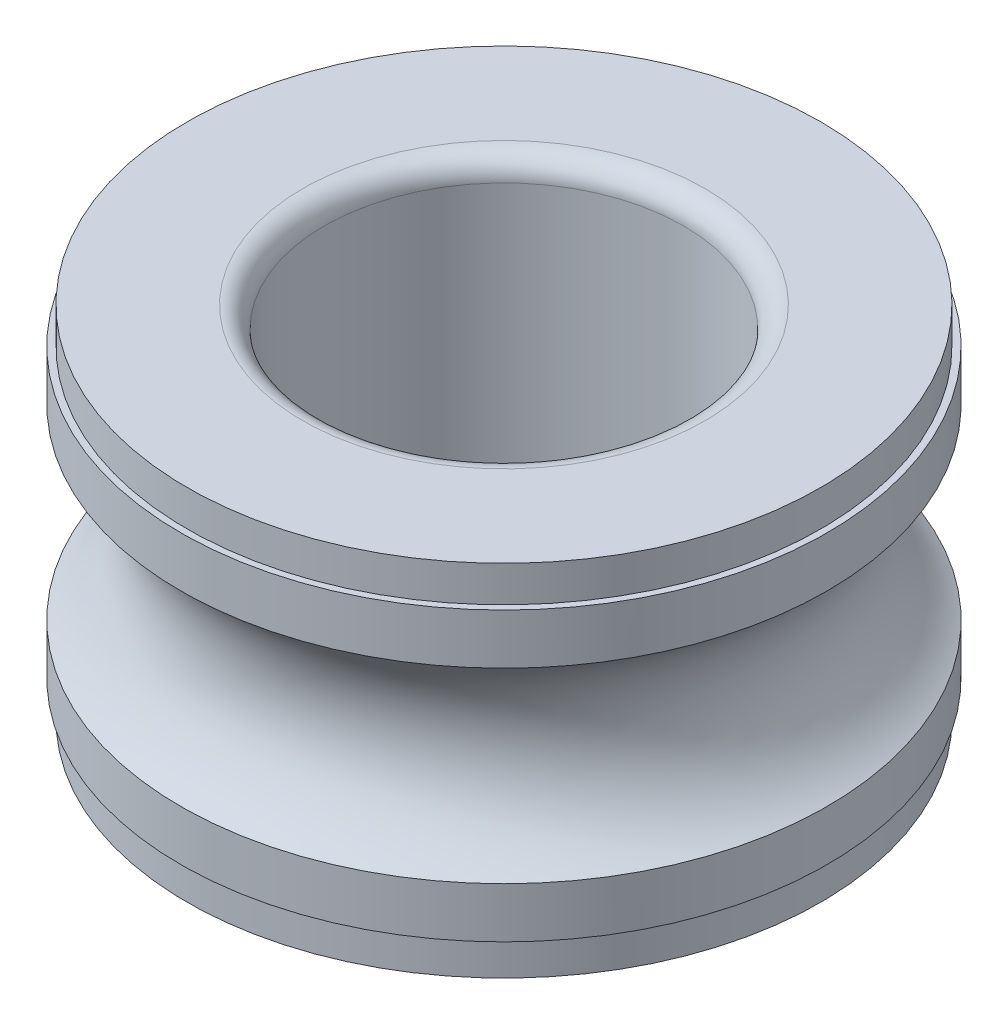
ISO-10303-21;
HEADER;
FILE_DESCRIPTION(('STEP AP214'),'2;1');
FILE_NAME('part.step','',(''),(''),'','','');
FILE_SCHEMA(('AUTOMOTIVE_DESIGN { 1 0 10303 214 1 1 1 1 }'));
ENDSEC;
DATA;
#1=APPLICATION_CONTEXT('core data for automotive mechanical design processes');
#2=APPLICATION_PROTOCOL_DEFINITION('international standard','automotive_design',2000,#1);
#3=PRODUCT_CONTEXT('',#1,'mechanical');
#4=PRODUCT('Part','Part','',(#3));
#5=PRODUCT_RELATED_PRODUCT_CATEGORY('part','',(#4));
#6=PRODUCT_DEFINITION_FORMATION('','',#4);
#7=PRODUCT_DEFINITION_CONTEXT('part definition',#1,'design');
#8=PRODUCT_DEFINITION('design','',#6,#7);
#9=PRODUCT_DEFINITION_SHAPE('','',#8);
#10=(LENGTH_UNIT() NAMED_UNIT(*) SI_UNIT(.MILLI.,.METRE.));
#11=(NAMED_UNIT(*) PLANE_ANGLE_UNIT() SI_UNIT($,.RADIAN.));
#12=(NAMED_UNIT(*) SI_UNIT($,.STERADIAN.) SOLID_ANGLE_UNIT());
#13=UNCERTAINTY_MEASURE_WITH_UNIT(LENGTH_MEASURE(1.E-05),#10,'distance_accuracy_value','');
#14=(GEOMETRIC_REPRESENTATION_CONTEXT(3) GLOBAL_UNCERTAINTY_ASSIGNED_CONTEXT((#13)) GLOBAL_UNIT_ASSIGNED_CONTEXT((#10,
#11,#12)) REPRESENTATION_CONTEXT('',''));
#15=CARTESIAN_POINT('',(0.,0.,0.));
#16=DIRECTION('',(0.,0.,1.));
#17=DIRECTION('',(1.,0.,0.));
#18=AXIS2_PLACEMENT_3D('',#15,#16,#17);
#19=CARTESIAN_POINT('',(0.,-2.5,0.));
#20=DIRECTION('',(0.,1.,0.));
#21=DIRECTION('',(0.,0.,1.));
#22=AXIS2_PLACEMENT_3D('',#19,#20,#21);
#23=CYLINDRICAL_SURFACE('',#22,2.5);
#24=CARTESIAN_POINT('',(0.,-0.3,0.));
#25=DIRECTION('',(0.,1.,0.));
#26=DIRECTION('',(0.,0.,1.));
#27=AXIS2_PLACEMENT_3D('',#24,#25,#26);
#28=CIRCLE('',#27,2.5);
#29=CARTESIAN_POINT('',(0.,-0.3,-2.5));
#30=VERTEX_POINT('',#29);
#31=EDGE_CURVE('E11',#30,#30,#28,.T.);
#32=ORIENTED_EDGE('',*,*,#31,.T.);
#33=EDGE_LOOP('',(#32));
#34=FACE_BOUND('',#33,.T.);
#35=CARTESIAN_POINT('',(0.,-4.7,0.));
#36=DIRECTION('',(0.,1.,0.));
#37=DIRECTION('',(0.,0.,1.));
#38=AXIS2_PLACEMENT_3D('',#35,#36,#37);
#39=CIRCLE('',#38,2.5);
#40=CARTESIAN_POINT('',(0.,-4.7,-2.5));
#41=VERTEX_POINT('',#40);
#42=EDGE_CURVE('E28',#41,#41,#39,.T.);
#43=ORIENTED_EDGE('',*,*,#42,.F.);
#44=EDGE_LOOP('',(#43));
#45=FACE_BOUND('',#44,.T.);
#46=ADVANCED_FACE('F17',(#34,#45),#23,.F.);
#47=CARTESIAN_POINT('',(0.,-4.7,0.));
#48=DIRECTION('',(0.,1.,0.));
#49=DIRECTION('',(0.,0.,1.));
#50=AXIS2_PLACEMENT_3D('',#47,#48,#49);
#51=TOROIDAL_SURFACE('',#50,2.8,0.3);
#52=ORIENTED_EDGE('',*,*,#42,.T.);
#53=EDGE_LOOP('',(#52));
#54=FACE_BOUND('',#53,.T.);
#55=CARTESIAN_POINT('',(0.,-5.,0.));
#56=DIRECTION('',(0.,1.,0.));
#57=DIRECTION('',(0.,0.,1.));
#58=AXIS2_PLACEMENT_3D('',#55,#56,#57);
#59=CIRCLE('',#58,2.8);
#60=CARTESIAN_POINT('',(0.,-5.,-2.8));
#61=VERTEX_POINT('',#60);
#62=EDGE_CURVE('E118',#61,#61,#59,.T.);
#63=ORIENTED_EDGE('',*,*,#62,.F.);
#64=EDGE_LOOP('',(#63));
#65=FACE_BOUND('',#64,.T.);
#66=ADVANCED_FACE('F180',(#54,#65),#51,.T.);
#67=CARTESIAN_POINT('',(0.,-0.3,0.));
#68=DIRECTION('',(0.,1.,0.));
#69=DIRECTION('',(0.,0.,1.));
#70=AXIS2_PLACEMENT_3D('',#67,#68,#69);
#71=TOROIDAL_SURFACE('',#70,2.8,0.3);
#72=CARTESIAN_POINT('',(0.,0.,0.));
#73=DIRECTION('',(0.,1.,0.));
#74=DIRECTION('',(0.,0.,1.));
#75=AXIS2_PLACEMENT_3D('',#72,#73,#74);
#76=CIRCLE('',#75,2.8);
#77=CARTESIAN_POINT('',(0.,0.,-2.8));
#78=VERTEX_POINT('',#77);
#79=EDGE_CURVE('E121',#78,#78,#76,.T.);
#80=ORIENTED_EDGE('',*,*,#79,.T.);
#81=EDGE_LOOP('',(#80));
#82=FACE_BOUND('',#81,.T.);
#83=ORIENTED_EDGE('',*,*,#31,.F.);
#84=EDGE_LOOP('',(#83));
#85=FACE_BOUND('',#84,.T.);
#86=ADVANCED_FACE('F184',(#82,#85),#71,.T.);
#87=CARTESIAN_POINT('',(0.,-5.,3.605));
#88=DIRECTION('',(0.,-1.,0.));
#89=DIRECTION('',(-1.,0.,0.));
#90=AXIS2_PLACEMENT_3D('',#87,#88,#89);
#91=PLANE('',#90);
#92=CARTESIAN_POINT('',(0.,-5.,0.));
#93=DIRECTION('',(0.,1.,0.));
#94=DIRECTION('',(0.,0.,1.));
#95=AXIS2_PLACEMENT_3D('',#92,#93,#94);
#96=CIRCLE('',#95,4.41);
#97=CARTESIAN_POINT('',(0.,-5.,-4.41));
#98=VERTEX_POINT('',#97);
#99=EDGE_CURVE('E113',#98,#98,#96,.T.);
#100=ORIENTED_EDGE('',*,*,#99,.F.);
#101=EDGE_LOOP('',(#100));
#102=FACE_BOUND('',#101,.T.);
#103=ORIENTED_EDGE('',*,*,#62,.T.);
#104=EDGE_LOOP('',(#103));
#105=FACE_BOUND('',#104,.T.);
#106=ADVANCED_FACE('F206',(#102,#105),#91,.T.);
#107=CARTESIAN_POINT('',(0.,0.,3.605));
#108=DIRECTION('',(0.,1.,0.));
#109=DIRECTION('',(1.,0.,0.));
#110=AXIS2_PLACEMENT_3D('',#107,#108,#109);
#111=PLANE('',#110);
#112=ORIENTED_EDGE('',*,*,#79,.F.);
#113=EDGE_LOOP('',(#112));
#114=FACE_BOUND('',#113,.T.);
#115=CARTESIAN_POINT('',(0.,0.,0.));
#116=DIRECTION('',(0.,1.,0.));
#117=DIRECTION('',(0.,0.,1.));
#118=AXIS2_PLACEMENT_3D('',#115,#116,#117);
#119=CIRCLE('',#118,4.41);
#120=CARTESIAN_POINT('',(0.,0.,-4.41));
#121=VERTEX_POINT('',#120);
#122=EDGE_CURVE('E109',#121,#121,#119,.T.);
#123=ORIENTED_EDGE('',*,*,#122,.T.);
#124=EDGE_LOOP('',(#123));
#125=FACE_BOUND('',#124,.T.);
#126=ADVANCED_FACE('F210',(#114,#125),#111,.T.);
#127=CARTESIAN_POINT('',(0.,-4.75,0.));
#128=DIRECTION('',(0.,1.,0.));
#129=DIRECTION('',(0.,0.,1.));
#130=AXIS2_PLACEMENT_3D('',#127,#128,#129);
#131=CYLINDRICAL_SURFACE('',#130,4.41);
#132=ORIENTED_EDGE('',*,*,#99,.T.);
#133=EDGE_LOOP('',(#132));
#134=FACE_BOUND('',#133,.T.);
#135=CARTESIAN_POINT('',(0.,-4.5,0.));
#136=DIRECTION('',(0.,1.,0.));
#137=DIRECTION('',(0.,0.,1.));
#138=AXIS2_PLACEMENT_3D('',#135,#136,#137);
#139=CIRCLE('',#138,4.41);
#140=CARTESIAN_POINT('',(0.,-4.5,-4.41));
#141=VERTEX_POINT('',#140);
#142=EDGE_CURVE('E137',#141,#141,#139,.T.);
#143=ORIENTED_EDGE('',*,*,#142,.F.);
#144=EDGE_LOOP('',(#143));
#145=FACE_BOUND('',#144,.T.);
#146=ADVANCED_FACE('F19',(#134,#145),#131,.T.);
#147=CARTESIAN_POINT('',(0.,-2.5,0.));
#148=DIRECTION('',(0.,1.,0.));
#149=DIRECTION('',(0.,0.,1.));
#150=AXIS2_PLACEMENT_3D('',#147,#148,#149);
#151=TOROIDAL_SURFACE('',#150,5.25,1.5);
#152=CARTESIAN_POINT('',(0.,-1.20096189432334,0.));
#153=DIRECTION('',(0.,1.,0.));
#154=DIRECTION('',(0.,0.,1.));
#155=AXIS2_PLACEMENT_3D('',#152,#153,#154);
#156=CIRCLE('',#155,4.5);
#157=CARTESIAN_POINT('',(4.5,-1.20096189432334,0.));
#158=VERTEX_POINT('',#157);
#159=EDGE_CURVE('E95',#158,#158,#156,.T.);
#160=ORIENTED_EDGE('',*,*,#159,.F.);
#161=EDGE_LOOP('',(#160));
#162=FACE_BOUND('',#161,.T.);
#163=CARTESIAN_POINT('',(0.,-3.79903810567666,0.));
#164=DIRECTION('',(0.,1.,0.));
#165=DIRECTION('',(0.,0.,1.));
#166=AXIS2_PLACEMENT_3D('',#163,#164,#165);
#167=CIRCLE('',#166,4.5);
#168=CARTESIAN_POINT('',(3.18198051533947,-3.79903810567666,3.18198051533946));
#169=VERTEX_POINT('',#168);
#170=EDGE_CURVE('E111',#169,#169,#167,.T.);
#171=ORIENTED_EDGE('',*,*,#170,.T.);
#172=EDGE_LOOP('',(#171));
#173=FACE_BOUND('',#172,.T.);
#174=ADVANCED_FACE('F96',(#162,#173),#151,.F.);
#175=CARTESIAN_POINT('',(0.,-0.25,0.));
#176=DIRECTION('',(0.,1.,0.));
#177=DIRECTION('',(0.,0.,1.));
#178=AXIS2_PLACEMENT_3D('',#175,#176,#177);
#179=CYLINDRICAL_SURFACE('',#178,4.41);
#180=CARTESIAN_POINT('',(0.,-0.5,0.));
#181=DIRECTION('',(0.,1.,0.));
#182=DIRECTION('',(0.,0.,1.));
#183=AXIS2_PLACEMENT_3D('',#180,#181,#182);
#184=CIRCLE('',#183,4.41);
#185=CARTESIAN_POINT('',(0.,-0.5,-4.41));
#186=VERTEX_POINT('',#185);
#187=EDGE_CURVE('E65',#186,#186,#184,.T.);
#188=ORIENTED_EDGE('',*,*,#187,.T.);
#189=EDGE_LOOP('',(#188));
#190=FACE_BOUND('',#189,.T.);
#191=ORIENTED_EDGE('',*,*,#122,.F.);
#192=EDGE_LOOP('',(#191));
#193=FACE_BOUND('',#192,.T.);
#194=ADVANCED_FACE('F143',(#190,#193),#179,.T.);
#195=CARTESIAN_POINT('',(0.,-4.5,4.455));
#196=DIRECTION('',(0.,-1.,0.));
#197=DIRECTION('',(-1.,0.,0.));
#198=AXIS2_PLACEMENT_3D('',#195,#196,#197);
#199=PLANE('',#198);
#200=CARTESIAN_POINT('',(0.,-4.5,0.));
#201=DIRECTION('',(0.,1.,0.));
#202=DIRECTION('',(0.,0.,1.));
#203=AXIS2_PLACEMENT_3D('',#200,#201,#202);
#204=CIRCLE('',#203,4.5);
#205=CARTESIAN_POINT('',(0.,-4.5,-4.5));
#206=VERTEX_POINT('',#205);
#207=EDGE_CURVE('E21',#206,#206,#204,.T.);
#208=ORIENTED_EDGE('',*,*,#207,.F.);
#209=EDGE_LOOP('',(#208));
#210=FACE_BOUND('',#209,.T.);
#211=ORIENTED_EDGE('',*,*,#142,.T.);
#212=EDGE_LOOP('',(#211));
#213=FACE_BOUND('',#212,.T.);
#214=ADVANCED_FACE('F146',(#210,#213),#199,.T.);
#215=CARTESIAN_POINT('',(0.,-4.14951905283833,0.));
#216=DIRECTION('',(0.,1.,0.));
#217=DIRECTION('',(0.,0.,1.));
#218=AXIS2_PLACEMENT_3D('',#215,#216,#217);
#219=CYLINDRICAL_SURFACE('',#218,4.5);
#220=ORIENTED_EDGE('',*,*,#207,.T.);
#221=EDGE_LOOP('',(#220));
#222=FACE_BOUND('',#221,.T.);
#223=ORIENTED_EDGE('',*,*,#170,.F.);
#224=EDGE_LOOP('',(#223));
#225=FACE_BOUND('',#224,.T.);
#226=ADVANCED_FACE('F192',(#222,#225),#219,.T.);
#227=CARTESIAN_POINT('',(0.,-0.5,4.455));
#228=DIRECTION('',(0.,1.,0.));
#229=DIRECTION('',(1.,0.,0.));
#230=AXIS2_PLACEMENT_3D('',#227,#228,#229);
#231=PLANE('',#230);
#232=ORIENTED_EDGE('',*,*,#187,.F.);
#233=EDGE_LOOP('',(#232));
#234=FACE_BOUND('',#233,.T.);
#235=CARTESIAN_POINT('',(0.,-0.5,0.));
#236=DIRECTION('',(0.,1.,0.));
#237=DIRECTION('',(0.,0.,1.));
#238=AXIS2_PLACEMENT_3D('',#235,#236,#237);
#239=CIRCLE('',#238,4.5);
#240=CARTESIAN_POINT('',(0.,-0.5,-4.5));
#241=VERTEX_POINT('',#240);
#242=EDGE_CURVE('E84',#241,#241,#239,.T.);
#243=ORIENTED_EDGE('',*,*,#242,.T.);
#244=EDGE_LOOP('',(#243));
#245=FACE_BOUND('',#244,.T.);
#246=ADVANCED_FACE('F201',(#234,#245),#231,.T.);
#247=CARTESIAN_POINT('',(0.,-0.850480947161671,0.));
#248=DIRECTION('',(0.,1.,0.));
#249=DIRECTION('',(0.,0.,1.));
#250=AXIS2_PLACEMENT_3D('',#247,#248,#249);
#251=CYLINDRICAL_SURFACE('',#250,4.5);
#252=ORIENTED_EDGE('',*,*,#159,.T.);
#253=EDGE_LOOP('',(#252));
#254=FACE_BOUND('',#253,.T.);
#255=ORIENTED_EDGE('',*,*,#242,.F.);
#256=EDGE_LOOP('',(#255));
#257=FACE_BOUND('',#256,.T.);
#258=ADVANCED_FACE('F197',(#254,#257),#251,.T.);
#259=CLOSED_SHELL('',(#46,#66,#86,#106,#126,#146,#174,#194,#214,#226,#246,#258));
#260=MANIFOLD_SOLID_BREP('B1',#259);
#261=ADVANCED_BREP_SHAPE_REPRESENTATION('',(#18,#260),#14);
#262=SHAPE_DEFINITION_REPRESENTATION(#9,#261);
ENDSEC;
END-ISO-10303-21;
